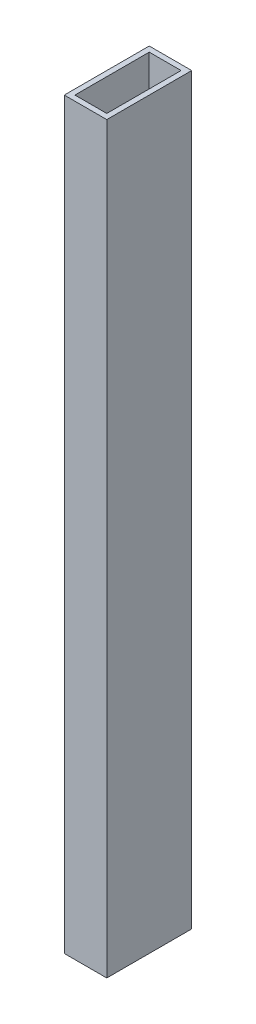
ISO-10303-21;
HEADER;
FILE_DESCRIPTION(('STEP AP214'),'2;1');
FILE_NAME('part.step','',(''),(''),'','','');
FILE_SCHEMA(('AUTOMOTIVE_DESIGN { 1 0 10303 214 1 1 1 1 }'));
ENDSEC;
DATA;
#1=APPLICATION_CONTEXT('core data for automotive mechanical design processes');
#2=APPLICATION_PROTOCOL_DEFINITION('international standard','automotive_design',2000,#1);
#3=PRODUCT_CONTEXT('',#1,'mechanical');
#4=PRODUCT('Part','Part','',(#3));
#5=PRODUCT_RELATED_PRODUCT_CATEGORY('part','',(#4));
#6=PRODUCT_DEFINITION_FORMATION('','',#4);
#7=PRODUCT_DEFINITION_CONTEXT('part definition',#1,'design');
#8=PRODUCT_DEFINITION('design','',#6,#7);
#9=PRODUCT_DEFINITION_SHAPE('','',#8);
#10=(LENGTH_UNIT() NAMED_UNIT(*) SI_UNIT(.MILLI.,.METRE.));
#11=(NAMED_UNIT(*) PLANE_ANGLE_UNIT() SI_UNIT($,.RADIAN.));
#12=(NAMED_UNIT(*) SI_UNIT($,.STERADIAN.) SOLID_ANGLE_UNIT());
#13=UNCERTAINTY_MEASURE_WITH_UNIT(LENGTH_MEASURE(1.E-05),#10,'distance_accuracy_value','');
#14=(GEOMETRIC_REPRESENTATION_CONTEXT(3) GLOBAL_UNCERTAINTY_ASSIGNED_CONTEXT((#13)) GLOBAL_UNIT_ASSIGNED_CONTEXT((#10,
#11,#12)) REPRESENTATION_CONTEXT('',''));
#15=CARTESIAN_POINT('',(0.,0.,0.));
#16=DIRECTION('',(0.,0.,1.));
#17=DIRECTION('',(1.,0.,0.));
#18=AXIS2_PLACEMENT_3D('',#15,#16,#17);
#19=CARTESIAN_POINT('',(0.,444.5,0.));
#20=DIRECTION('',(0.,-1.,0.));
#21=DIRECTION('',(0.,0.,-1.));
#22=AXIS2_PLACEMENT_3D('',#19,#20,#21);
#23=PLANE('',#22);
#24=DIRECTION('',(0.,0.,-1.));
#25=VECTOR('',#24,1.);
#26=CARTESIAN_POINT('',(12.7,444.5,25.4));
#27=LINE('',#26,#25);
#28=CARTESIAN_POINT('',(12.7,444.5,25.4));
#29=VERTEX_POINT('',#28);
#30=CARTESIAN_POINT('',(12.7,444.5,-25.4));
#31=VERTEX_POINT('',#30);
#32=EDGE_CURVE('E159',#29,#31,#27,.T.);
#33=ORIENTED_EDGE('',*,*,#32,.T.);
#34=DIRECTION('',(-1.,0.,0.));
#35=VECTOR('',#34,1.);
#36=CARTESIAN_POINT('',(-12.7,444.5,-25.4));
#37=LINE('',#36,#35);
#38=CARTESIAN_POINT('',(-12.7,444.5,-25.4));
#39=VERTEX_POINT('',#38);
#40=EDGE_CURVE('E163',#31,#39,#37,.T.);
#41=ORIENTED_EDGE('',*,*,#40,.T.);
#42=DIRECTION('',(0.,0.,1.));
#43=VECTOR('',#42,1.);
#44=CARTESIAN_POINT('',(-12.7,444.5,25.4));
#45=LINE('',#44,#43);
#46=CARTESIAN_POINT('',(-12.7,444.5,25.4));
#47=VERTEX_POINT('',#46);
#48=EDGE_CURVE('E167',#39,#47,#45,.T.);
#49=ORIENTED_EDGE('',*,*,#48,.T.);
#50=DIRECTION('',(1.,0.,0.));
#51=VECTOR('',#50,1.);
#52=CARTESIAN_POINT('',(-12.7,444.5,25.4));
#53=LINE('',#52,#51);
#54=EDGE_CURVE('E170',#47,#29,#53,.T.);
#55=ORIENTED_EDGE('',*,*,#54,.T.);
#56=EDGE_LOOP('',(#33,#41,#49,#55));
#57=FACE_BOUND('',#56,.T.);
#58=DIRECTION('',(0.,0.,1.));
#59=VECTOR('',#58,1.);
#60=CARTESIAN_POINT('',(-9.525,444.5,22.225));
#61=LINE('',#60,#59);
#62=CARTESIAN_POINT('',(-9.525,444.5,-22.225));
#63=VERTEX_POINT('',#62);
#64=CARTESIAN_POINT('',(-9.525,444.5,22.225));
#65=VERTEX_POINT('',#64);
#66=EDGE_CURVE('E111',#63,#65,#61,.T.);
#67=ORIENTED_EDGE('',*,*,#66,.F.);
#68=DIRECTION('',(-1.,0.,0.));
#69=VECTOR('',#68,1.);
#70=CARTESIAN_POINT('',(-9.525,444.5,-22.225));
#71=LINE('',#70,#69);
#72=CARTESIAN_POINT('',(9.525,444.5,-22.225));
#73=VERTEX_POINT('',#72);
#74=EDGE_CURVE('E137',#73,#63,#71,.T.);
#75=ORIENTED_EDGE('',*,*,#74,.F.);
#76=DIRECTION('',(0.,0.,-1.));
#77=VECTOR('',#76,1.);
#78=CARTESIAN_POINT('',(9.525,444.5,22.225));
#79=LINE('',#78,#77);
#80=CARTESIAN_POINT('',(9.525,444.5,22.225));
#81=VERTEX_POINT('',#80);
#82=EDGE_CURVE('E133',#81,#73,#79,.T.);
#83=ORIENTED_EDGE('',*,*,#82,.F.);
#84=DIRECTION('',(1.,0.,0.));
#85=VECTOR('',#84,1.);
#86=CARTESIAN_POINT('',(-9.525,444.5,22.225));
#87=LINE('',#86,#85);
#88=EDGE_CURVE('E120',#65,#81,#87,.T.);
#89=ORIENTED_EDGE('',*,*,#88,.F.);
#90=EDGE_LOOP('',(#67,#75,#83,#89));
#91=FACE_BOUND('',#90,.T.);
#92=ADVANCED_FACE('F45',(#57,#91),#23,.F.);
#93=CARTESIAN_POINT('',(0.,0.,0.));
#94=DIRECTION('',(0.,-1.,0.));
#95=DIRECTION('',(0.,0.,-1.));
#96=AXIS2_PLACEMENT_3D('',#93,#94,#95);
#97=PLANE('',#96);
#98=DIRECTION('',(0.,0.,-1.));
#99=VECTOR('',#98,1.);
#100=CARTESIAN_POINT('',(12.7,0.,25.4));
#101=LINE('',#100,#99);
#102=CARTESIAN_POINT('',(12.7,0.,25.4));
#103=VERTEX_POINT('',#102);
#104=CARTESIAN_POINT('',(12.7,0.,-25.4));
#105=VERTEX_POINT('',#104);
#106=EDGE_CURVE('E129',#103,#105,#101,.T.);
#107=ORIENTED_EDGE('',*,*,#106,.F.);
#108=DIRECTION('',(1.,0.,0.));
#109=VECTOR('',#108,1.);
#110=CARTESIAN_POINT('',(-12.7,0.,25.4));
#111=LINE('',#110,#109);
#112=CARTESIAN_POINT('',(-12.7,0.,25.4));
#113=VERTEX_POINT('',#112);
#114=EDGE_CURVE('E164',#113,#103,#111,.T.);
#115=ORIENTED_EDGE('',*,*,#114,.F.);
#116=DIRECTION('',(0.,0.,1.));
#117=VECTOR('',#116,1.);
#118=CARTESIAN_POINT('',(-12.7,0.,25.4));
#119=LINE('',#118,#117);
#120=CARTESIAN_POINT('',(-12.7,0.,-25.4));
#121=VERTEX_POINT('',#120);
#122=EDGE_CURVE('E180',#121,#113,#119,.T.);
#123=ORIENTED_EDGE('',*,*,#122,.F.);
#124=DIRECTION('',(-1.,0.,0.));
#125=VECTOR('',#124,1.);
#126=CARTESIAN_POINT('',(-12.7,0.,-25.4));
#127=LINE('',#126,#125);
#128=EDGE_CURVE('E177',#105,#121,#127,.T.);
#129=ORIENTED_EDGE('',*,*,#128,.F.);
#130=EDGE_LOOP('',(#107,#115,#123,#129));
#131=FACE_BOUND('',#130,.T.);
#132=DIRECTION('',(-1.,0.,0.));
#133=VECTOR('',#132,1.);
#134=CARTESIAN_POINT('',(-9.525,0.,-22.225));
#135=LINE('',#134,#133);
#136=CARTESIAN_POINT('',(9.525,0.,-22.225));
#137=VERTEX_POINT('',#136);
#138=CARTESIAN_POINT('',(-9.525,0.,-22.225));
#139=VERTEX_POINT('',#138);
#140=EDGE_CURVE('E121',#137,#139,#135,.T.);
#141=ORIENTED_EDGE('',*,*,#140,.T.);
#142=DIRECTION('',(0.,0.,1.));
#143=VECTOR('',#142,1.);
#144=CARTESIAN_POINT('',(-9.525,0.,22.225));
#145=LINE('',#144,#143);
#146=CARTESIAN_POINT('',(-9.525,0.,22.225));
#147=VERTEX_POINT('',#146);
#148=EDGE_CURVE('E69',#139,#147,#145,.T.);
#149=ORIENTED_EDGE('',*,*,#148,.T.);
#150=DIRECTION('',(1.,0.,0.));
#151=VECTOR('',#150,1.);
#152=CARTESIAN_POINT('',(-9.525,0.,22.225));
#153=LINE('',#152,#151);
#154=CARTESIAN_POINT('',(9.525,0.,22.225));
#155=VERTEX_POINT('',#154);
#156=EDGE_CURVE('E127',#147,#155,#153,.T.);
#157=ORIENTED_EDGE('',*,*,#156,.T.);
#158=DIRECTION('',(0.,0.,-1.));
#159=VECTOR('',#158,1.);
#160=CARTESIAN_POINT('',(9.525,0.,22.225));
#161=LINE('',#160,#159);
#162=EDGE_CURVE('E146',#155,#137,#161,.T.);
#163=ORIENTED_EDGE('',*,*,#162,.T.);
#164=EDGE_LOOP('',(#141,#149,#157,#163));
#165=FACE_BOUND('',#164,.T.);
#166=ADVANCED_FACE('F203',(#131,#165),#97,.T.);
#167=CARTESIAN_POINT('',(12.7,444.5,25.4));
#168=DIRECTION('',(-1.,0.,0.));
#169=DIRECTION('',(0.,0.,1.));
#170=AXIS2_PLACEMENT_3D('',#167,#168,#169);
#171=PLANE('',#170);
#172=ORIENTED_EDGE('',*,*,#106,.T.);
#173=DIRECTION('',(0.,-1.,0.));
#174=VECTOR('',#173,1.);
#175=CARTESIAN_POINT('',(12.7,444.5,-25.4));
#176=LINE('',#175,#174);
#177=EDGE_CURVE('E11',#31,#105,#176,.T.);
#178=ORIENTED_EDGE('',*,*,#177,.F.);
#179=ORIENTED_EDGE('',*,*,#32,.F.);
#180=DIRECTION('',(0.,-1.,0.));
#181=VECTOR('',#180,1.);
#182=CARTESIAN_POINT('',(12.7,444.5,25.4));
#183=LINE('',#182,#181);
#184=EDGE_CURVE('E173',#29,#103,#183,.T.);
#185=ORIENTED_EDGE('',*,*,#184,.T.);
#186=EDGE_LOOP('',(#172,#178,#179,#185));
#187=FACE_BOUND('',#186,.T.);
#188=ADVANCED_FACE('F47',(#187),#171,.F.);
#189=CARTESIAN_POINT('',(-12.7,444.5,-25.4));
#190=DIRECTION('',(0.,0.,1.));
#191=DIRECTION('',(1.,0.,0.));
#192=AXIS2_PLACEMENT_3D('',#189,#190,#191);
#193=PLANE('',#192);
#194=ORIENTED_EDGE('',*,*,#128,.T.);
#195=DIRECTION('',(0.,-1.,0.));
#196=VECTOR('',#195,1.);
#197=CARTESIAN_POINT('',(-12.7,444.5,-25.4));
#198=LINE('',#197,#196);
#199=EDGE_CURVE('E54',#39,#121,#198,.T.);
#200=ORIENTED_EDGE('',*,*,#199,.F.);
#201=ORIENTED_EDGE('',*,*,#40,.F.);
#202=ORIENTED_EDGE('',*,*,#177,.T.);
#203=EDGE_LOOP('',(#194,#200,#201,#202));
#204=FACE_BOUND('',#203,.T.);
#205=ADVANCED_FACE('F213',(#204),#193,.F.);
#206=CARTESIAN_POINT('',(-12.7,444.5,25.4));
#207=DIRECTION('',(1.,0.,0.));
#208=DIRECTION('',(0.,0.,-1.));
#209=AXIS2_PLACEMENT_3D('',#206,#207,#208);
#210=PLANE('',#209);
#211=ORIENTED_EDGE('',*,*,#122,.T.);
#212=DIRECTION('',(0.,-1.,0.));
#213=VECTOR('',#212,1.);
#214=CARTESIAN_POINT('',(-12.7,444.5,25.4));
#215=LINE('',#214,#213);
#216=EDGE_CURVE('E188',#47,#113,#215,.T.);
#217=ORIENTED_EDGE('',*,*,#216,.F.);
#218=ORIENTED_EDGE('',*,*,#48,.F.);
#219=ORIENTED_EDGE('',*,*,#199,.T.);
#220=EDGE_LOOP('',(#211,#217,#218,#219));
#221=FACE_BOUND('',#220,.T.);
#222=ADVANCED_FACE('F197',(#221),#210,.F.);
#223=CARTESIAN_POINT('',(-12.7,444.5,25.4));
#224=DIRECTION('',(0.,0.,-1.));
#225=DIRECTION('',(-1.,0.,0.));
#226=AXIS2_PLACEMENT_3D('',#223,#224,#225);
#227=PLANE('',#226);
#228=ORIENTED_EDGE('',*,*,#114,.T.);
#229=ORIENTED_EDGE('',*,*,#184,.F.);
#230=ORIENTED_EDGE('',*,*,#54,.F.);
#231=ORIENTED_EDGE('',*,*,#216,.T.);
#232=EDGE_LOOP('',(#228,#229,#230,#231));
#233=FACE_BOUND('',#232,.T.);
#234=ADVANCED_FACE('F207',(#233),#227,.F.);
#235=CARTESIAN_POINT('',(-9.525,444.5,22.225));
#236=DIRECTION('',(1.,0.,0.));
#237=DIRECTION('',(0.,0.,-1.));
#238=AXIS2_PLACEMENT_3D('',#235,#236,#237);
#239=PLANE('',#238);
#240=ORIENTED_EDGE('',*,*,#148,.F.);
#241=DIRECTION('',(0.,-1.,0.));
#242=VECTOR('',#241,1.);
#243=CARTESIAN_POINT('',(-9.525,444.5,-22.225));
#244=LINE('',#243,#242);
#245=EDGE_CURVE('E115',#63,#139,#244,.T.);
#246=ORIENTED_EDGE('',*,*,#245,.F.);
#247=ORIENTED_EDGE('',*,*,#66,.T.);
#248=DIRECTION('',(0.,-1.,0.));
#249=VECTOR('',#248,1.);
#250=CARTESIAN_POINT('',(-9.525,444.5,22.225));
#251=LINE('',#250,#249);
#252=EDGE_CURVE('E114',#65,#147,#251,.T.);
#253=ORIENTED_EDGE('',*,*,#252,.T.);
#254=EDGE_LOOP('',(#240,#246,#247,#253));
#255=FACE_BOUND('',#254,.T.);
#256=ADVANCED_FACE('F113',(#255),#239,.T.);
#257=CARTESIAN_POINT('',(-9.525,444.5,22.225));
#258=DIRECTION('',(0.,0.,-1.));
#259=DIRECTION('',(-1.,0.,0.));
#260=AXIS2_PLACEMENT_3D('',#257,#258,#259);
#261=PLANE('',#260);
#262=ORIENTED_EDGE('',*,*,#156,.F.);
#263=ORIENTED_EDGE('',*,*,#252,.F.);
#264=ORIENTED_EDGE('',*,*,#88,.T.);
#265=DIRECTION('',(0.,-1.,0.));
#266=VECTOR('',#265,1.);
#267=CARTESIAN_POINT('',(9.525,444.5,22.225));
#268=LINE('',#267,#266);
#269=EDGE_CURVE('E130',#81,#155,#268,.T.);
#270=ORIENTED_EDGE('',*,*,#269,.T.);
#271=EDGE_LOOP('',(#262,#263,#264,#270));
#272=FACE_BOUND('',#271,.T.);
#273=ADVANCED_FACE('F124',(#272),#261,.T.);
#274=CARTESIAN_POINT('',(9.525,444.5,22.225));
#275=DIRECTION('',(-1.,0.,0.));
#276=DIRECTION('',(0.,0.,1.));
#277=AXIS2_PLACEMENT_3D('',#274,#275,#276);
#278=PLANE('',#277);
#279=ORIENTED_EDGE('',*,*,#162,.F.);
#280=ORIENTED_EDGE('',*,*,#269,.F.);
#281=ORIENTED_EDGE('',*,*,#82,.T.);
#282=DIRECTION('',(0.,-1.,0.));
#283=VECTOR('',#282,1.);
#284=CARTESIAN_POINT('',(9.525,444.5,-22.225));
#285=LINE('',#284,#283);
#286=EDGE_CURVE('E61',#73,#137,#285,.T.);
#287=ORIENTED_EDGE('',*,*,#286,.T.);
#288=EDGE_LOOP('',(#279,#280,#281,#287));
#289=FACE_BOUND('',#288,.T.);
#290=ADVANCED_FACE('F236',(#289),#278,.T.);
#291=CARTESIAN_POINT('',(-9.525,444.5,-22.225));
#292=DIRECTION('',(0.,0.,1.));
#293=DIRECTION('',(1.,0.,0.));
#294=AXIS2_PLACEMENT_3D('',#291,#292,#293);
#295=PLANE('',#294);
#296=ORIENTED_EDGE('',*,*,#140,.F.);
#297=ORIENTED_EDGE('',*,*,#286,.F.);
#298=ORIENTED_EDGE('',*,*,#74,.T.);
#299=ORIENTED_EDGE('',*,*,#245,.T.);
#300=EDGE_LOOP('',(#296,#297,#298,#299));
#301=FACE_BOUND('',#300,.T.);
#302=ADVANCED_FACE('F240',(#301),#295,.T.);
#303=CLOSED_SHELL('',(#92,#166,#188,#205,#222,#234,#256,#273,#290,#302));
#304=MANIFOLD_SOLID_BREP('B2',#303);
#305=ADVANCED_BREP_SHAPE_REPRESENTATION('',(#18,#304),#14);
#306=SHAPE_DEFINITION_REPRESENTATION(#9,#305);
ENDSEC;
END-ISO-10303-21;
